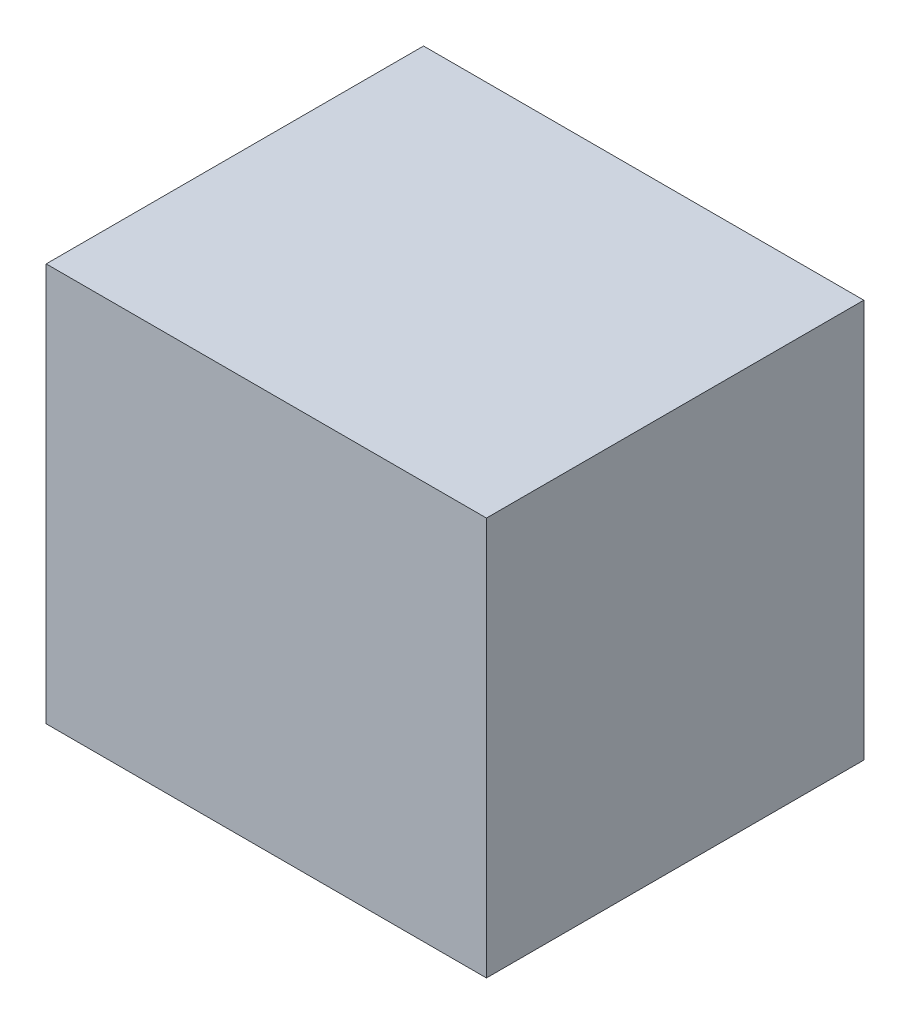
ISO-10303-21;
HEADER;
FILE_DESCRIPTION(('STEP AP214'),'2;1');
FILE_NAME('part.step','',(''),(''),'','','');
FILE_SCHEMA(('AUTOMOTIVE_DESIGN { 1 0 10303 214 1 1 1 1 }'));
ENDSEC;
DATA;
#1=APPLICATION_CONTEXT('core data for automotive mechanical design processes');
#2=APPLICATION_PROTOCOL_DEFINITION('international standard','automotive_design',2000,#1);
#3=PRODUCT_CONTEXT('',#1,'mechanical');
#4=PRODUCT('Part','Part','',(#3));
#5=PRODUCT_RELATED_PRODUCT_CATEGORY('part','',(#4));
#6=PRODUCT_DEFINITION_FORMATION('','',#4);
#7=PRODUCT_DEFINITION_CONTEXT('part definition',#1,'design');
#8=PRODUCT_DEFINITION('design','',#6,#7);
#9=PRODUCT_DEFINITION_SHAPE('','',#8);
#10=(LENGTH_UNIT() NAMED_UNIT(*) SI_UNIT(.MILLI.,.METRE.));
#11=(NAMED_UNIT(*) PLANE_ANGLE_UNIT() SI_UNIT($,.RADIAN.));
#12=(NAMED_UNIT(*) SI_UNIT($,.STERADIAN.) SOLID_ANGLE_UNIT());
#13=UNCERTAINTY_MEASURE_WITH_UNIT(LENGTH_MEASURE(1.E-05),#10,'distance_accuracy_value','');
#14=(GEOMETRIC_REPRESENTATION_CONTEXT(3) GLOBAL_UNCERTAINTY_ASSIGNED_CONTEXT((#13)) GLOBAL_UNIT_ASSIGNED_CONTEXT((#10,
#11,#12)) REPRESENTATION_CONTEXT('',''));
#15=CARTESIAN_POINT('',(0.,0.,0.));
#16=DIRECTION('',(0.,0.,1.));
#17=DIRECTION('',(1.,0.,0.));
#18=AXIS2_PLACEMENT_3D('',#15,#16,#17);
#19=CARTESIAN_POINT('',(-0.52500022,0.47500032,0.90000074));
#20=DIRECTION('',(0.,0.,-1.));
#21=DIRECTION('',(-1.,0.,0.));
#22=AXIS2_PLACEMENT_3D('',#19,#20,#21);
#23=PLANE('',#22);
#24=DIRECTION('',(1.,0.,0.));
#25=VECTOR('',#24,1.);
#26=CARTESIAN_POINT('',(-0.52500022,-0.47500032,0.90000074));
#27=LINE('',#26,#25);
#28=CARTESIAN_POINT('',(-0.52500022,-0.47500032,0.90000074));
#29=VERTEX_POINT('',#28);
#30=CARTESIAN_POINT('',(0.52500022,-0.47500032,0.90000074));
#31=VERTEX_POINT('',#30);
#32=EDGE_CURVE('E55',#29,#31,#27,.T.);
#33=ORIENTED_EDGE('',*,*,#32,.T.);
#34=DIRECTION('',(0.,1.,0.));
#35=VECTOR('',#34,1.);
#36=CARTESIAN_POINT('',(0.52500022,-0.47500032,0.90000074));
#37=LINE('',#36,#35);
#38=CARTESIAN_POINT('',(0.52500022,0.47500032,0.90000074));
#39=VERTEX_POINT('',#38);
#40=EDGE_CURVE('E57',#31,#39,#37,.T.);
#41=ORIENTED_EDGE('',*,*,#40,.T.);
#42=DIRECTION('',(1.,0.,0.));
#43=VECTOR('',#42,1.);
#44=CARTESIAN_POINT('',(0.52500022,0.47500032,0.90000074));
#45=LINE('',#44,#43);
#46=CARTESIAN_POINT('',(-0.52500022,0.47500032,0.90000074));
#47=VERTEX_POINT('',#46);
#48=EDGE_CURVE('E20',#39,#47,#45,.F.);
#49=ORIENTED_EDGE('',*,*,#48,.T.);
#50=DIRECTION('',(0.,1.,0.));
#51=VECTOR('',#50,1.);
#52=CARTESIAN_POINT('',(-0.52500022,0.47500032,0.90000074));
#53=LINE('',#52,#51);
#54=EDGE_CURVE('E80',#47,#29,#53,.F.);
#55=ORIENTED_EDGE('',*,*,#54,.T.);
#56=EDGE_LOOP('',(#33,#41,#49,#55));
#57=FACE_BOUND('',#56,.T.);
#58=ADVANCED_FACE('F17',(#57),#23,.F.);
#59=CARTESIAN_POINT('',(0.52500022,0.47500032,0.));
#60=DIRECTION('',(0.,-1.,0.));
#61=DIRECTION('',(0.,0.,-1.));
#62=AXIS2_PLACEMENT_3D('',#59,#60,#61);
#63=PLANE('',#62);
#64=DIRECTION('',(0.,0.,-1.));
#65=VECTOR('',#64,1.);
#66=CARTESIAN_POINT('',(-0.52500022,0.47500032,0.));
#67=LINE('',#66,#65);
#68=CARTESIAN_POINT('',(-0.52500022,0.47500032,0.));
#69=VERTEX_POINT('',#68);
#70=EDGE_CURVE('E68',#69,#47,#67,.F.);
#71=ORIENTED_EDGE('',*,*,#70,.T.);
#72=ORIENTED_EDGE('',*,*,#48,.F.);
#73=DIRECTION('',(0.,0.,1.));
#74=VECTOR('',#73,1.);
#75=CARTESIAN_POINT('',(0.52500022,0.47500032,0.));
#76=LINE('',#75,#74);
#77=CARTESIAN_POINT('',(0.52500022,0.47500032,0.));
#78=VERTEX_POINT('',#77);
#79=EDGE_CURVE('E63',#39,#78,#76,.F.);
#80=ORIENTED_EDGE('',*,*,#79,.T.);
#81=DIRECTION('',(-1.,0.,0.));
#82=VECTOR('',#81,1.);
#83=CARTESIAN_POINT('',(-0.52500022,0.47500032,0.));
#84=LINE('',#83,#82);
#85=EDGE_CURVE('E83',#69,#78,#84,.F.);
#86=ORIENTED_EDGE('',*,*,#85,.F.);
#87=EDGE_LOOP('',(#71,#72,#80,#86));
#88=FACE_BOUND('',#87,.T.);
#89=ADVANCED_FACE('F65',(#88),#63,.F.);
#90=CARTESIAN_POINT('',(0.52500022,-0.47500032,0.));
#91=DIRECTION('',(-1.,0.,0.));
#92=DIRECTION('',(0.,0.,1.));
#93=AXIS2_PLACEMENT_3D('',#90,#91,#92);
#94=PLANE('',#93);
#95=ORIENTED_EDGE('',*,*,#79,.F.);
#96=ORIENTED_EDGE('',*,*,#40,.F.);
#97=DIRECTION('',(0.,0.,1.));
#98=VECTOR('',#97,1.);
#99=CARTESIAN_POINT('',(0.52500022,-0.47500032,0.));
#100=LINE('',#99,#98);
#101=CARTESIAN_POINT('',(0.52500022,-0.47500032,0.));
#102=VERTEX_POINT('',#101);
#103=EDGE_CURVE('E75',#31,#102,#100,.F.);
#104=ORIENTED_EDGE('',*,*,#103,.T.);
#105=DIRECTION('',(0.,1.,0.));
#106=VECTOR('',#105,1.);
#107=CARTESIAN_POINT('',(0.52500022,0.47500032,0.));
#108=LINE('',#107,#106);
#109=EDGE_CURVE('E72',#78,#102,#108,.F.);
#110=ORIENTED_EDGE('',*,*,#109,.F.);
#111=EDGE_LOOP('',(#95,#96,#104,#110));
#112=FACE_BOUND('',#111,.T.);
#113=ADVANCED_FACE('F70',(#112),#94,.F.);
#114=CARTESIAN_POINT('',(-0.52500022,-0.47500032,0.));
#115=DIRECTION('',(0.,1.,0.));
#116=DIRECTION('',(0.,0.,1.));
#117=AXIS2_PLACEMENT_3D('',#114,#115,#116);
#118=PLANE('',#117);
#119=ORIENTED_EDGE('',*,*,#103,.F.);
#120=ORIENTED_EDGE('',*,*,#32,.F.);
#121=DIRECTION('',(0.,0.,-1.));
#122=VECTOR('',#121,1.);
#123=CARTESIAN_POINT('',(-0.52500022,-0.47500032,0.));
#124=LINE('',#123,#122);
#125=CARTESIAN_POINT('',(-0.52500022,-0.47500032,0.));
#126=VERTEX_POINT('',#125);
#127=EDGE_CURVE('E35',#29,#126,#124,.T.);
#128=ORIENTED_EDGE('',*,*,#127,.T.);
#129=DIRECTION('',(-1.,0.,0.));
#130=VECTOR('',#129,1.);
#131=CARTESIAN_POINT('',(-0.52500022,-0.47500032,0.));
#132=LINE('',#131,#130);
#133=EDGE_CURVE('E26',#102,#126,#132,.T.);
#134=ORIENTED_EDGE('',*,*,#133,.F.);
#135=EDGE_LOOP('',(#119,#120,#128,#134));
#136=FACE_BOUND('',#135,.T.);
#137=ADVANCED_FACE('F89',(#136),#118,.F.);
#138=CARTESIAN_POINT('',(-0.52500022,0.47500032,0.));
#139=DIRECTION('',(1.,0.,0.));
#140=DIRECTION('',(0.,0.,-1.));
#141=AXIS2_PLACEMENT_3D('',#138,#139,#140);
#142=PLANE('',#141);
#143=ORIENTED_EDGE('',*,*,#127,.F.);
#144=ORIENTED_EDGE('',*,*,#54,.F.);
#145=ORIENTED_EDGE('',*,*,#70,.F.);
#146=DIRECTION('',(0.,1.,0.));
#147=VECTOR('',#146,1.);
#148=CARTESIAN_POINT('',(-0.52500022,0.47500032,0.));
#149=LINE('',#148,#147);
#150=EDGE_CURVE('E11',#126,#69,#149,.T.);
#151=ORIENTED_EDGE('',*,*,#150,.F.);
#152=EDGE_LOOP('',(#143,#144,#145,#151));
#153=FACE_BOUND('',#152,.T.);
#154=ADVANCED_FACE('F91',(#153),#142,.F.);
#155=CARTESIAN_POINT('',(-0.52500022,0.47500032,0.));
#156=DIRECTION('',(0.,0.,-1.));
#157=DIRECTION('',(-1.,0.,0.));
#158=AXIS2_PLACEMENT_3D('',#155,#156,#157);
#159=PLANE('',#158);
#160=ORIENTED_EDGE('',*,*,#133,.T.);
#161=ORIENTED_EDGE('',*,*,#150,.T.);
#162=ORIENTED_EDGE('',*,*,#85,.T.);
#163=ORIENTED_EDGE('',*,*,#109,.T.);
#164=EDGE_LOOP('',(#160,#161,#162,#163));
#165=FACE_BOUND('',#164,.T.);
#166=ADVANCED_FACE('F88',(#165),#159,.T.);
#167=CLOSED_SHELL('',(#58,#89,#113,#137,#154,#166));
#168=MANIFOLD_SOLID_BREP('B1',#167);
#169=ADVANCED_BREP_SHAPE_REPRESENTATION('',(#18,#168),#14);
#170=SHAPE_DEFINITION_REPRESENTATION(#9,#169);
ENDSEC;
END-ISO-10303-21;
